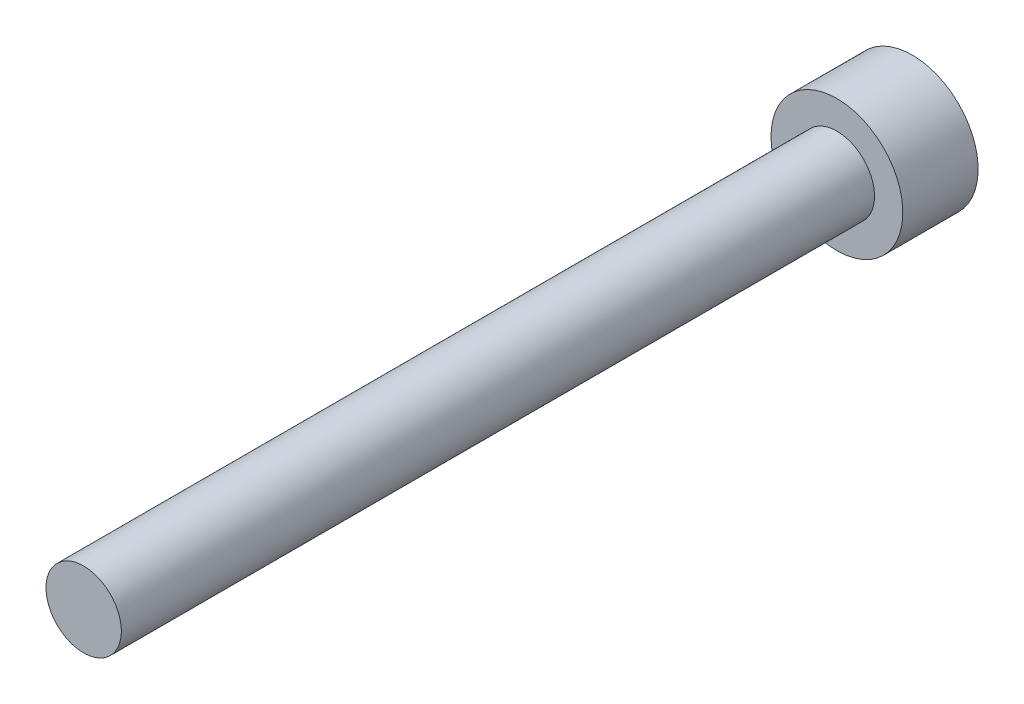
ISO-10303-21;
HEADER;
FILE_DESCRIPTION(('STEP AP214'),'2;1');
FILE_NAME('part.step','',(''),(''),'','','');
FILE_SCHEMA(('AUTOMOTIVE_DESIGN { 1 0 10303 214 1 1 1 1 }'));
ENDSEC;
DATA;
#1=APPLICATION_CONTEXT('core data for automotive mechanical design processes');
#2=APPLICATION_PROTOCOL_DEFINITION('international standard','automotive_design',2000,#1);
#3=PRODUCT_CONTEXT('',#1,'mechanical');
#4=PRODUCT('Part','Part','',(#3));
#5=PRODUCT_RELATED_PRODUCT_CATEGORY('part','',(#4));
#6=PRODUCT_DEFINITION_FORMATION('','',#4);
#7=PRODUCT_DEFINITION_CONTEXT('part definition',#1,'design');
#8=PRODUCT_DEFINITION('design','',#6,#7);
#9=PRODUCT_DEFINITION_SHAPE('','',#8);
#10=(LENGTH_UNIT() NAMED_UNIT(*) SI_UNIT(.MILLI.,.METRE.));
#11=(NAMED_UNIT(*) PLANE_ANGLE_UNIT() SI_UNIT($,.RADIAN.));
#12=(NAMED_UNIT(*) SI_UNIT($,.STERADIAN.) SOLID_ANGLE_UNIT());
#13=UNCERTAINTY_MEASURE_WITH_UNIT(LENGTH_MEASURE(1.E-05),#10,'distance_accuracy_value','');
#14=(GEOMETRIC_REPRESENTATION_CONTEXT(3) GLOBAL_UNCERTAINTY_ASSIGNED_CONTEXT((#13)) GLOBAL_UNIT_ASSIGNED_CONTEXT((#10,
#11,#12)) REPRESENTATION_CONTEXT('',''));
#15=CARTESIAN_POINT('',(0.,0.,0.));
#16=DIRECTION('',(0.,0.,1.));
#17=DIRECTION('',(1.,0.,0.));
#18=AXIS2_PLACEMENT_3D('',#15,#16,#17);
#19=CARTESIAN_POINT('',(0.,0.,0.));
#20=DIRECTION('',(0.,0.,-1.));
#21=DIRECTION('',(-1.,0.,0.));
#22=AXIS2_PLACEMENT_3D('',#19,#20,#21);
#23=PLANE('',#22);
#24=CARTESIAN_POINT('',(0.,0.,0.));
#25=DIRECTION('',(0.,0.,-1.));
#26=DIRECTION('',(-1.,0.,0.));
#27=AXIS2_PLACEMENT_3D('',#24,#25,#26);
#28=CIRCLE('',#27,2.);
#29=CARTESIAN_POINT('',(-2.,0.,0.));
#30=VERTEX_POINT('',#29);
#31=EDGE_CURVE('E11',#30,#30,#28,.T.);
#32=ORIENTED_EDGE('',*,*,#31,.F.);
#33=EDGE_LOOP('',(#32));
#34=FACE_BOUND('',#33,.T.);
#35=ADVANCED_FACE('F36',(#34),#23,.F.);
#36=CARTESIAN_POINT('',(0.,0.,-44.));
#37=DIRECTION('',(0.,0.,-1.));
#38=DIRECTION('',(-1.,0.,0.));
#39=AXIS2_PLACEMENT_3D('',#36,#37,#38);
#40=CYLINDRICAL_SURFACE('',#39,2.);
#41=CARTESIAN_POINT('',(0.,0.,-40.));
#42=DIRECTION('',(0.,0.,-1.));
#43=DIRECTION('',(-1.,0.,0.));
#44=AXIS2_PLACEMENT_3D('',#41,#42,#43);
#45=CIRCLE('',#44,2.);
#46=CARTESIAN_POINT('',(-1.99999999999999,0.,-40.));
#47=VERTEX_POINT('',#46);
#48=EDGE_CURVE('E43',#47,#47,#45,.T.);
#49=ORIENTED_EDGE('',*,*,#48,.F.);
#50=EDGE_LOOP('',(#49));
#51=FACE_BOUND('',#50,.T.);
#52=ORIENTED_EDGE('',*,*,#31,.T.);
#53=EDGE_LOOP('',(#52));
#54=FACE_BOUND('',#53,.T.);
#55=ADVANCED_FACE('F152',(#51,#54),#40,.T.);
#56=CARTESIAN_POINT('',(2.,0.,-40.));
#57=DIRECTION('',(0.,0.,-1.));
#58=DIRECTION('',(-1.,0.,0.));
#59=AXIS2_PLACEMENT_3D('',#56,#57,#58);
#60=PLANE('',#59);
#61=CARTESIAN_POINT('',(0.,0.,-40.));
#62=DIRECTION('',(0.,0.,-1.));
#63=DIRECTION('',(-1.,0.,0.));
#64=AXIS2_PLACEMENT_3D('',#61,#62,#63);
#65=CIRCLE('',#64,3.5);
#66=CARTESIAN_POINT('',(-3.5,0.,-40.));
#67=VERTEX_POINT('',#66);
#68=EDGE_CURVE('E145',#67,#67,#65,.T.);
#69=ORIENTED_EDGE('',*,*,#68,.F.);
#70=EDGE_LOOP('',(#69));
#71=FACE_BOUND('',#70,.T.);
#72=ORIENTED_EDGE('',*,*,#48,.T.);
#73=EDGE_LOOP('',(#72));
#74=FACE_BOUND('',#73,.T.);
#75=ADVANCED_FACE('F150',(#71,#74),#60,.F.);
#76=CARTESIAN_POINT('',(0.,0.,-44.));
#77=DIRECTION('',(0.,0.,-1.));
#78=DIRECTION('',(-1.,0.,0.));
#79=AXIS2_PLACEMENT_3D('',#76,#77,#78);
#80=CYLINDRICAL_SURFACE('',#79,3.5);
#81=CARTESIAN_POINT('',(0.,0.,-44.));
#82=DIRECTION('',(0.,0.,-1.));
#83=DIRECTION('',(-1.,0.,0.));
#84=AXIS2_PLACEMENT_3D('',#81,#82,#83);
#85=CIRCLE('',#84,3.5);
#86=CARTESIAN_POINT('',(-3.5,0.,-44.));
#87=VERTEX_POINT('',#86);
#88=EDGE_CURVE('E137',#87,#87,#85,.T.);
#89=ORIENTED_EDGE('',*,*,#88,.F.);
#90=EDGE_LOOP('',(#89));
#91=FACE_BOUND('',#90,.T.);
#92=ORIENTED_EDGE('',*,*,#68,.T.);
#93=EDGE_LOOP('',(#92));
#94=FACE_BOUND('',#93,.T.);
#95=ADVANCED_FACE('F170',(#91,#94),#80,.T.);
#96=CARTESIAN_POINT('',(3.5,0.,-44.));
#97=DIRECTION('',(0.,0.,1.));
#98=DIRECTION('',(1.,0.,0.));
#99=AXIS2_PLACEMENT_3D('',#96,#97,#98);
#100=PLANE('',#99);
#101=DIRECTION('',(-1.,0.,0.));
#102=VECTOR('',#101,1.);
#103=CARTESIAN_POINT('',(0.866025403784441,-1.5,-44.));
#104=LINE('',#103,#102);
#105=CARTESIAN_POINT('',(0.866025403784441,-1.5,-44.));
#106=VERTEX_POINT('',#105);
#107=CARTESIAN_POINT('',(-0.866025403784435,-1.5,-44.));
#108=VERTEX_POINT('',#107);
#109=EDGE_CURVE('E124',#106,#108,#104,.T.);
#110=ORIENTED_EDGE('',*,*,#109,.F.);
#111=DIRECTION('',(-0.499999999999999,-0.866025403784439,0.));
#112=VECTOR('',#111,1.);
#113=CARTESIAN_POINT('',(1.73205080756888,0.,-44.));
#114=LINE('',#113,#112);
#115=CARTESIAN_POINT('',(1.73205080756888,0.,-44.));
#116=VERTEX_POINT('',#115);
#117=EDGE_CURVE('E50',#116,#106,#114,.T.);
#118=ORIENTED_EDGE('',*,*,#117,.F.);
#119=DIRECTION('',(0.500000000000003,-0.866025403784437,0.));
#120=VECTOR('',#119,1.);
#121=CARTESIAN_POINT('',(0.866025403784435,1.5,-44.));
#122=LINE('',#121,#120);
#123=CARTESIAN_POINT('',(0.866025403784435,1.5,-44.));
#124=VERTEX_POINT('',#123);
#125=EDGE_CURVE('E133',#124,#116,#122,.T.);
#126=ORIENTED_EDGE('',*,*,#125,.F.);
#127=DIRECTION('',(1.,0.,0.));
#128=VECTOR('',#127,1.);
#129=CARTESIAN_POINT('',(-0.866025403784446,1.49999999999999,-44.));
#130=LINE('',#129,#128);
#131=CARTESIAN_POINT('',(-0.866025403784446,1.49999999999999,-44.));
#132=VERTEX_POINT('',#131);
#133=EDGE_CURVE('E131',#132,#124,#130,.T.);
#134=ORIENTED_EDGE('',*,*,#133,.F.);
#135=DIRECTION('',(0.499999999999993,0.866025403784443,0.));
#136=VECTOR('',#135,1.);
#137=CARTESIAN_POINT('',(-1.73205080756887,0.,-44.));
#138=LINE('',#137,#136);
#139=CARTESIAN_POINT('',(-1.73205080756887,0.,-44.));
#140=VERTEX_POINT('',#139);
#141=EDGE_CURVE('E98',#140,#132,#138,.T.);
#142=ORIENTED_EDGE('',*,*,#141,.F.);
#143=DIRECTION('',(-0.500000000000004,0.866025403784436,0.));
#144=VECTOR('',#143,1.);
#145=CARTESIAN_POINT('',(-0.866025403784435,-1.5,-44.));
#146=LINE('',#145,#144);
#147=EDGE_CURVE('E127',#108,#140,#146,.T.);
#148=ORIENTED_EDGE('',*,*,#147,.F.);
#149=EDGE_LOOP('',(#110,#118,#126,#134,#142,#148));
#150=FACE_BOUND('',#149,.T.);
#151=ORIENTED_EDGE('',*,*,#88,.T.);
#152=EDGE_LOOP('',(#151));
#153=FACE_BOUND('',#152,.T.);
#154=ADVANCED_FACE('F178',(#150,#153),#100,.F.);
#155=CARTESIAN_POINT('',(1.73205080756888,0.,-41.));
#156=DIRECTION('',(0.866025403784439,-0.499999999999999,0.));
#157=DIRECTION('',(0.499999999999999,0.866025403784439,0.));
#158=AXIS2_PLACEMENT_3D('',#155,#156,#157);
#159=PLANE('',#158);
#160=ORIENTED_EDGE('',*,*,#117,.T.);
#161=DIRECTION('',(0.,0.,-1.));
#162=VECTOR('',#161,1.);
#163=CARTESIAN_POINT('',(0.866025403784441,-1.5,-41.));
#164=LINE('',#163,#162);
#165=CARTESIAN_POINT('',(0.866025403784441,-1.5,-41.));
#166=VERTEX_POINT('',#165);
#167=EDGE_CURVE('E80',#166,#106,#164,.T.);
#168=ORIENTED_EDGE('',*,*,#167,.F.);
#169=DIRECTION('',(-0.499999999999999,-0.866025403784439,0.));
#170=VECTOR('',#169,1.);
#171=CARTESIAN_POINT('',(1.73205080756888,0.,-41.));
#172=LINE('',#171,#170);
#173=CARTESIAN_POINT('',(1.73205080756888,0.,-41.));
#174=VERTEX_POINT('',#173);
#175=EDGE_CURVE('E135',#174,#166,#172,.T.);
#176=ORIENTED_EDGE('',*,*,#175,.F.);
#177=DIRECTION('',(0.,0.,-1.));
#178=VECTOR('',#177,1.);
#179=CARTESIAN_POINT('',(1.73205080756888,0.,-41.));
#180=LINE('',#179,#178);
#181=EDGE_CURVE('E58',#174,#116,#180,.T.);
#182=ORIENTED_EDGE('',*,*,#181,.T.);
#183=EDGE_LOOP('',(#160,#168,#176,#182));
#184=FACE_BOUND('',#183,.T.);
#185=ADVANCED_FACE('F186',(#184),#159,.F.);
#186=CARTESIAN_POINT('',(0.866025403784435,1.5,-41.));
#187=DIRECTION('',(0.866025403784437,0.500000000000003,0.));
#188=DIRECTION('',(-0.500000000000003,0.866025403784437,0.));
#189=AXIS2_PLACEMENT_3D('',#186,#187,#188);
#190=PLANE('',#189);
#191=ORIENTED_EDGE('',*,*,#125,.T.);
#192=ORIENTED_EDGE('',*,*,#181,.F.);
#193=DIRECTION('',(0.500000000000003,-0.866025403784437,0.));
#194=VECTOR('',#193,1.);
#195=CARTESIAN_POINT('',(0.866025403784435,1.5,-41.));
#196=LINE('',#195,#194);
#197=CARTESIAN_POINT('',(0.866025403784435,1.5,-41.));
#198=VERTEX_POINT('',#197);
#199=EDGE_CURVE('E110',#198,#174,#196,.T.);
#200=ORIENTED_EDGE('',*,*,#199,.F.);
#201=DIRECTION('',(0.,0.,-1.));
#202=VECTOR('',#201,1.);
#203=CARTESIAN_POINT('',(0.866025403784435,1.5,-41.));
#204=LINE('',#203,#202);
#205=EDGE_CURVE('E102',#198,#124,#204,.T.);
#206=ORIENTED_EDGE('',*,*,#205,.T.);
#207=EDGE_LOOP('',(#191,#192,#200,#206));
#208=FACE_BOUND('',#207,.T.);
#209=ADVANCED_FACE('F194',(#208),#190,.F.);
#210=CARTESIAN_POINT('',(-0.866025403784446,1.49999999999999,-41.));
#211=DIRECTION('',(0.,1.,0.));
#212=DIRECTION('',(-1.,0.,0.));
#213=AXIS2_PLACEMENT_3D('',#210,#211,#212);
#214=PLANE('',#213);
#215=ORIENTED_EDGE('',*,*,#133,.T.);
#216=ORIENTED_EDGE('',*,*,#205,.F.);
#217=DIRECTION('',(1.,0.,0.));
#218=VECTOR('',#217,1.);
#219=CARTESIAN_POINT('',(-0.866025403784446,1.49999999999999,-41.));
#220=LINE('',#219,#218);
#221=CARTESIAN_POINT('',(-0.866025403784446,1.49999999999999,-41.));
#222=VERTEX_POINT('',#221);
#223=EDGE_CURVE('E106',#222,#198,#220,.T.);
#224=ORIENTED_EDGE('',*,*,#223,.F.);
#225=DIRECTION('',(0.,0.,-1.));
#226=VECTOR('',#225,1.);
#227=CARTESIAN_POINT('',(-0.866025403784446,1.49999999999999,-41.));
#228=LINE('',#227,#226);
#229=EDGE_CURVE('E91',#222,#132,#228,.T.);
#230=ORIENTED_EDGE('',*,*,#229,.T.);
#231=EDGE_LOOP('',(#215,#216,#224,#230));
#232=FACE_BOUND('',#231,.T.);
#233=ADVANCED_FACE('F107',(#232),#214,.F.);
#234=CARTESIAN_POINT('',(-1.73205080756887,0.,-41.));
#235=DIRECTION('',(-0.866025403784443,0.499999999999993,0.));
#236=DIRECTION('',(-0.499999999999993,-0.866025403784443,0.));
#237=AXIS2_PLACEMENT_3D('',#234,#235,#236);
#238=PLANE('',#237);
#239=ORIENTED_EDGE('',*,*,#141,.T.);
#240=ORIENTED_EDGE('',*,*,#229,.F.);
#241=DIRECTION('',(0.499999999999993,0.866025403784443,0.));
#242=VECTOR('',#241,1.);
#243=CARTESIAN_POINT('',(-1.73205080756887,0.,-41.));
#244=LINE('',#243,#242);
#245=CARTESIAN_POINT('',(-1.73205080756887,0.,-41.));
#246=VERTEX_POINT('',#245);
#247=EDGE_CURVE('E95',#246,#222,#244,.T.);
#248=ORIENTED_EDGE('',*,*,#247,.F.);
#249=DIRECTION('',(0.,0.,-1.));
#250=VECTOR('',#249,1.);
#251=CARTESIAN_POINT('',(-1.73205080756887,0.,-41.));
#252=LINE('',#251,#250);
#253=EDGE_CURVE('E103',#246,#140,#252,.T.);
#254=ORIENTED_EDGE('',*,*,#253,.T.);
#255=EDGE_LOOP('',(#239,#240,#248,#254));
#256=FACE_BOUND('',#255,.T.);
#257=ADVANCED_FACE('F93',(#256),#238,.F.);
#258=CARTESIAN_POINT('',(-0.866025403784436,-1.5,-41.));
#259=DIRECTION('',(-0.866025403784436,-0.500000000000004,0.));
#260=DIRECTION('',(0.500000000000004,-0.866025403784436,0.));
#261=AXIS2_PLACEMENT_3D('',#258,#259,#260);
#262=PLANE('',#261);
#263=ORIENTED_EDGE('',*,*,#147,.T.);
#264=ORIENTED_EDGE('',*,*,#253,.F.);
#265=DIRECTION('',(-0.500000000000004,0.866025403784436,0.));
#266=VECTOR('',#265,1.);
#267=CARTESIAN_POINT('',(-0.866025403784436,-1.5,-41.));
#268=LINE('',#267,#266);
#269=CARTESIAN_POINT('',(-0.866025403784436,-1.5,-41.));
#270=VERTEX_POINT('',#269);
#271=EDGE_CURVE('E116',#270,#246,#268,.T.);
#272=ORIENTED_EDGE('',*,*,#271,.F.);
#273=DIRECTION('',(0.,0.,-1.));
#274=VECTOR('',#273,1.);
#275=CARTESIAN_POINT('',(-0.866025403784436,-1.5,-41.));
#276=LINE('',#275,#274);
#277=EDGE_CURVE('E140',#270,#108,#276,.T.);
#278=ORIENTED_EDGE('',*,*,#277,.T.);
#279=EDGE_LOOP('',(#263,#264,#272,#278));
#280=FACE_BOUND('',#279,.T.);
#281=ADVANCED_FACE('F213',(#280),#262,.F.);
#282=CARTESIAN_POINT('',(0.866025403784441,-1.5,-41.));
#283=DIRECTION('',(0.,-1.,0.));
#284=DIRECTION('',(0.,0.,-1.));
#285=AXIS2_PLACEMENT_3D('',#282,#283,#284);
#286=PLANE('',#285);
#287=ORIENTED_EDGE('',*,*,#109,.T.);
#288=ORIENTED_EDGE('',*,*,#277,.F.);
#289=DIRECTION('',(-1.,0.,0.));
#290=VECTOR('',#289,1.);
#291=CARTESIAN_POINT('',(0.866025403784441,-1.5,-41.));
#292=LINE('',#291,#290);
#293=EDGE_CURVE('E118',#166,#270,#292,.T.);
#294=ORIENTED_EDGE('',*,*,#293,.F.);
#295=ORIENTED_EDGE('',*,*,#167,.T.);
#296=EDGE_LOOP('',(#287,#288,#294,#295));
#297=FACE_BOUND('',#296,.T.);
#298=ADVANCED_FACE('F220',(#297),#286,.F.);
#299=CARTESIAN_POINT('',(0.,0.,-41.));
#300=DIRECTION('',(0.,0.,-1.));
#301=DIRECTION('',(-1.,0.,0.));
#302=AXIS2_PLACEMENT_3D('',#299,#300,#301);
#303=PLANE('',#302);
#304=ORIENTED_EDGE('',*,*,#175,.T.);
#305=ORIENTED_EDGE('',*,*,#293,.T.);
#306=ORIENTED_EDGE('',*,*,#271,.T.);
#307=ORIENTED_EDGE('',*,*,#247,.T.);
#308=ORIENTED_EDGE('',*,*,#223,.T.);
#309=ORIENTED_EDGE('',*,*,#199,.T.);
#310=EDGE_LOOP('',(#304,#305,#306,#307,#308,#309));
#311=FACE_BOUND('',#310,.T.);
#312=ADVANCED_FACE('F113',(#311),#303,.T.);
#313=CLOSED_SHELL('',(#35,#55,#75,#95,#154,#185,#209,#233,#257,#281,#298,#312));
#314=MANIFOLD_SOLID_BREP('B2',#313);
#315=ADVANCED_BREP_SHAPE_REPRESENTATION('',(#18,#314),#14);
#316=SHAPE_DEFINITION_REPRESENTATION(#9,#315);
ENDSEC;
END-ISO-10303-21;
